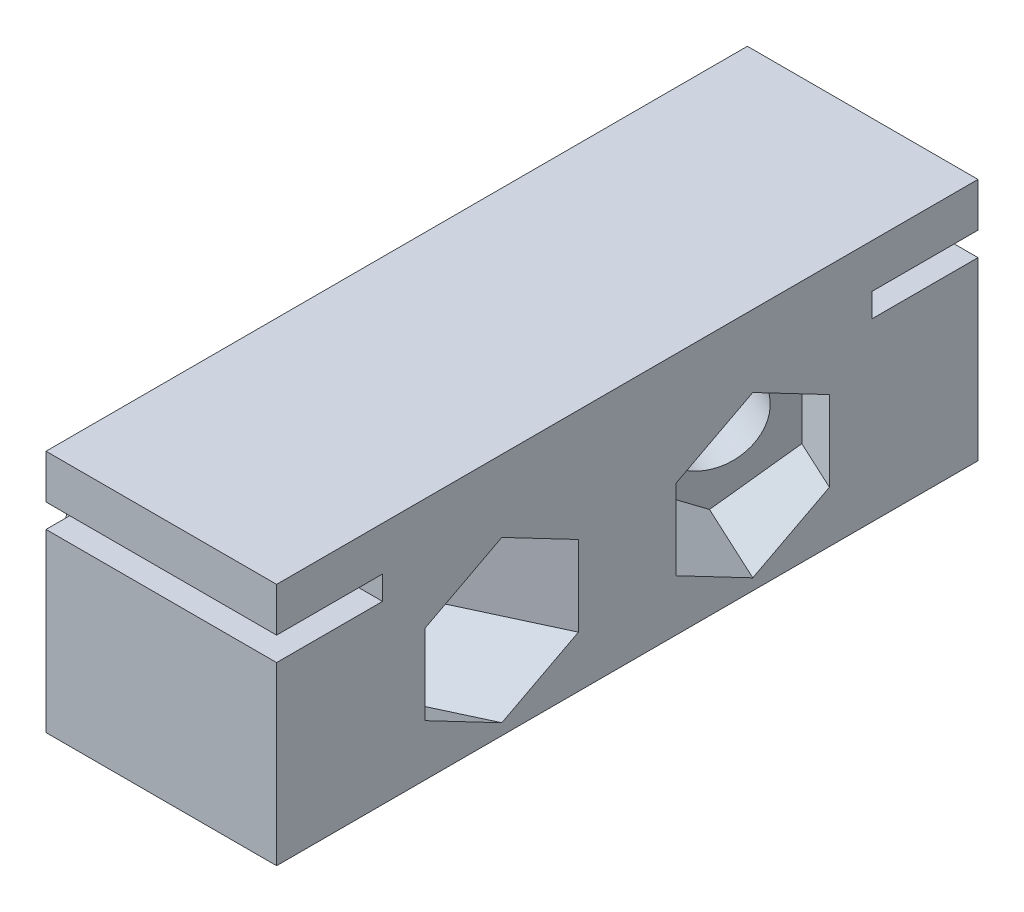
ISO-10303-21;
HEADER;
FILE_DESCRIPTION(('STEP AP214'),'2;1');
FILE_NAME('part.step','',(''),(''),'','','');
FILE_SCHEMA(('AUTOMOTIVE_DESIGN { 1 0 10303 214 1 1 1 1 }'));
ENDSEC;
DATA;
#1=APPLICATION_CONTEXT('core data for automotive mechanical design processes');
#2=APPLICATION_PROTOCOL_DEFINITION('international standard','automotive_design',2000,#1);
#3=PRODUCT_CONTEXT('',#1,'mechanical');
#4=PRODUCT('Part','Part','',(#3));
#5=PRODUCT_RELATED_PRODUCT_CATEGORY('part','',(#4));
#6=PRODUCT_DEFINITION_FORMATION('','',#4);
#7=PRODUCT_DEFINITION_CONTEXT('part definition',#1,'design');
#8=PRODUCT_DEFINITION('design','',#6,#7);
#9=PRODUCT_DEFINITION_SHAPE('','',#8);
#10=(LENGTH_UNIT() NAMED_UNIT(*) SI_UNIT(.MILLI.,.METRE.));
#11=(NAMED_UNIT(*) PLANE_ANGLE_UNIT() SI_UNIT($,.RADIAN.));
#12=(NAMED_UNIT(*) SI_UNIT($,.STERADIAN.) SOLID_ANGLE_UNIT());
#13=UNCERTAINTY_MEASURE_WITH_UNIT(LENGTH_MEASURE(1.E-05),#10,'distance_accuracy_value','');
#14=(GEOMETRIC_REPRESENTATION_CONTEXT(3) GLOBAL_UNCERTAINTY_ASSIGNED_CONTEXT((#13)) GLOBAL_UNIT_ASSIGNED_CONTEXT((#10,
#11,#12)) REPRESENTATION_CONTEXT('',''));
#15=CARTESIAN_POINT('',(0.,0.,0.));
#16=DIRECTION('',(0.,0.,1.));
#17=DIRECTION('',(1.,0.,0.));
#18=AXIS2_PLACEMENT_3D('',#15,#16,#17);
#19=CARTESIAN_POINT('',(-36.151227594584,4.03225000000007,25.3133620772626));
#20=DIRECTION('',(1.,0.,0.));
#21=DIRECTION('',(0.,1.,0.));
#22=AXIS2_PLACEMENT_3D('',#19,#20,#21);
#23=PLANE('',#22);
#24=DIRECTION('',(0.,-1.,0.));
#25=VECTOR('',#24,1.);
#26=CARTESIAN_POINT('',(-36.1512275945839,-13.55725,-25.3133620772626));
#27=LINE('',#26,#25);
#28=CARTESIAN_POINT('',(-36.151227594584,-0.857249999999983,-25.3133620772627));
#29=VERTEX_POINT('',#28);
#30=CARTESIAN_POINT('',(-36.1512275945839,-13.55725,-25.3133620772626));
#31=VERTEX_POINT('',#30);
#32=EDGE_CURVE('E258',#29,#31,#27,.T.);
#33=ORIENTED_EDGE('',*,*,#32,.T.);
#34=DIRECTION('',(0.,0.,1.));
#35=VECTOR('',#34,1.);
#36=CARTESIAN_POINT('',(-36.1512275945839,-13.55725,25.3133620772626));
#37=LINE('',#36,#35);
#38=CARTESIAN_POINT('',(-36.1512275945839,-13.55725,25.3133620772626));
#39=VERTEX_POINT('',#38);
#40=EDGE_CURVE('E229',#31,#39,#37,.T.);
#41=ORIENTED_EDGE('',*,*,#40,.T.);
#42=DIRECTION('',(0.,-1.,0.));
#43=VECTOR('',#42,1.);
#44=CARTESIAN_POINT('',(-36.1512275945839,-13.55725,25.3133620772626));
#45=LINE('',#44,#43);
#46=CARTESIAN_POINT('',(-36.1512275945839,-0.857249999999927,25.3133620772626));
#47=VERTEX_POINT('',#46);
#48=EDGE_CURVE('E264',#47,#39,#45,.T.);
#49=ORIENTED_EDGE('',*,*,#48,.F.);
#50=DIRECTION('',(0.,0.,1.));
#51=VECTOR('',#50,1.);
#52=CARTESIAN_POINT('',(-36.1512275945839,-0.857249999999983,25.3133620772626));
#53=LINE('',#52,#51);
#54=EDGE_CURVE('E413',#29,#47,#53,.T.);
#55=ORIENTED_EDGE('',*,*,#54,.F.);
#56=EDGE_LOOP('',(#33,#41,#49,#55));
#57=FACE_BOUND('',#56,.T.);
#58=CARTESIAN_POINT('',(-36.1512275945839,-6.95325,-16.7882402651653));
#59=DIRECTION('',(1.,0.,0.));
#60=DIRECTION('',(0.,0.,-1.));
#61=AXIS2_PLACEMENT_3D('',#58,#59,#60);
#62=ELLIPSE('',#61,5.51284260745173,5.);
#63=CARTESIAN_POINT('',(-36.1512275945839,-6.95325,-22.301082872617));
#64=VERTEX_POINT('',#63);
#65=EDGE_CURVE('E668',#64,#64,#62,.F.);
#66=ORIENTED_EDGE('',*,*,#65,.F.);
#67=EDGE_LOOP('',(#66));
#68=FACE_BOUND('',#67,.T.);
#69=CARTESIAN_POINT('',(-36.1512275945839,-6.95325,16.7882402651653));
#70=DIRECTION('',(1.,0.,0.));
#71=DIRECTION('',(0.,0.,1.));
#72=AXIS2_PLACEMENT_3D('',#69,#70,#71);
#73=ELLIPSE('',#72,5.51284260745173,5.);
#74=CARTESIAN_POINT('',(-36.1512275945839,-6.95325,22.301082872617));
#75=VERTEX_POINT('',#74);
#76=EDGE_CURVE('E12',#75,#75,#73,.F.);
#77=ORIENTED_EDGE('',*,*,#76,.F.);
#78=EDGE_LOOP('',(#77));
#79=FACE_BOUND('',#78,.T.);
#80=ADVANCED_FACE('F55',(#57,#68,#79),#23,.F.);
#81=CARTESIAN_POINT('',(-36.1512275945839,-0.857249999999983,25.3133620772626));
#82=DIRECTION('',(0.,-1.,0.));
#83=DIRECTION('',(1.,0.,0.));
#84=AXIS2_PLACEMENT_3D('',#81,#82,#83);
#85=PLANE('',#84);
#86=DIRECTION('',(-1.,0.,0.));
#87=VECTOR('',#86,1.);
#88=CARTESIAN_POINT('',(-19.5060580546316,-0.857249999999927,-25.3133620772626));
#89=LINE('',#88,#87);
#90=CARTESIAN_POINT('',(-19.5060580546316,-0.857249999999927,-25.3133620772626));
#91=VERTEX_POINT('',#90);
#92=EDGE_CURVE('E373',#91,#29,#89,.T.);
#93=ORIENTED_EDGE('',*,*,#92,.T.);
#94=ORIENTED_EDGE('',*,*,#54,.T.);
#95=DIRECTION('',(1.,0.,0.));
#96=VECTOR('',#95,1.);
#97=CARTESIAN_POINT('',(-36.1512275945839,-0.857249999999983,25.3133620772626));
#98=LINE('',#97,#96);
#99=CARTESIAN_POINT('',(-19.5060580546316,-0.857249999999927,25.3133620772626));
#100=VERTEX_POINT('',#99);
#101=EDGE_CURVE('E384',#47,#100,#98,.T.);
#102=ORIENTED_EDGE('',*,*,#101,.T.);
#103=DIRECTION('',(0.,0.,-1.));
#104=VECTOR('',#103,1.);
#105=CARTESIAN_POINT('',(-19.5060580546316,-0.857249999999927,25.3133620772626));
#106=LINE('',#105,#104);
#107=CARTESIAN_POINT('',(-19.5060580546316,-0.857249999999927,17.6647202985214));
#108=VERTEX_POINT('',#107);
#109=EDGE_CURVE('E70',#100,#108,#106,.T.);
#110=ORIENTED_EDGE('',*,*,#109,.T.);
#111=DIRECTION('',(1.,0.,0.));
#112=VECTOR('',#111,1.);
#113=CARTESIAN_POINT('',(-19.5060580546316,-0.857249999999926,17.6647202985214));
#114=LINE('',#113,#112);
#115=CARTESIAN_POINT('',(-25.2278350839902,-0.857249999999946,17.6647202985214));
#116=VERTEX_POINT('',#115);
#117=EDGE_CURVE('E423',#116,#108,#114,.T.);
#118=ORIENTED_EDGE('',*,*,#117,.F.);
#119=DIRECTION('',(0.,0.,1.));
#120=VECTOR('',#119,1.);
#121=CARTESIAN_POINT('',(-25.2278350839902,-0.857249999999948,-17.6647202985214));
#122=LINE('',#121,#120);
#123=CARTESIAN_POINT('',(-25.2278350839902,-0.857249999999948,-17.6647202985214));
#124=VERTEX_POINT('',#123);
#125=EDGE_CURVE('E421',#124,#116,#122,.T.);
#126=ORIENTED_EDGE('',*,*,#125,.F.);
#127=DIRECTION('',(-1.,0.,0.));
#128=VECTOR('',#127,1.);
#129=CARTESIAN_POINT('',(-25.2278350839902,-0.857249999999946,-17.6647202985214));
#130=LINE('',#129,#128);
#131=CARTESIAN_POINT('',(-19.5060580546316,-0.857249999999927,-17.6647202985214));
#132=VERTEX_POINT('',#131);
#133=EDGE_CURVE('E429',#132,#124,#130,.T.);
#134=ORIENTED_EDGE('',*,*,#133,.F.);
#135=DIRECTION('',(0.,0.,-1.));
#136=VECTOR('',#135,1.);
#137=CARTESIAN_POINT('',(-19.5060580546316,-0.857249999999927,-13.6582888906093));
#138=LINE('',#137,#136);
#139=EDGE_CURVE('E376',#132,#91,#138,.T.);
#140=ORIENTED_EDGE('',*,*,#139,.T.);
#141=EDGE_LOOP('',(#93,#94,#102,#110,#118,#126,#134,#140));
#142=FACE_BOUND('',#141,.T.);
#143=ADVANCED_FACE('F467',(#142),#85,.F.);
#144=CARTESIAN_POINT('',(-25.2278350839902,0.857250000000043,17.6647202985214));
#145=DIRECTION('',(0.,1.,0.));
#146=DIRECTION('',(-1.,0.,0.));
#147=AXIS2_PLACEMENT_3D('',#144,#145,#146);
#148=PLANE('',#147);
#149=DIRECTION('',(-1.,0.,0.));
#150=VECTOR('',#149,1.);
#151=CARTESIAN_POINT('',(-36.1512275945839,0.857250000000004,25.3133620772626));
#152=LINE('',#151,#150);
#153=CARTESIAN_POINT('',(-19.5060580546316,0.857250000000032,25.3133620772626));
#154=VERTEX_POINT('',#153);
#155=CARTESIAN_POINT('',(-36.1512275945839,0.857250000000016,25.3133620772626));
#156=VERTEX_POINT('',#155);
#157=EDGE_CURVE('E245',#154,#156,#152,.T.);
#158=ORIENTED_EDGE('',*,*,#157,.T.);
#159=DIRECTION('',(0.,0.,-1.));
#160=VECTOR('',#159,1.);
#161=CARTESIAN_POINT('',(-36.1512275945839,0.857250000000005,17.6647202985214));
#162=LINE('',#161,#160);
#163=CARTESIAN_POINT('',(-36.1512275945839,0.857250000000004,-25.3133620772626));
#164=VERTEX_POINT('',#163);
#165=EDGE_CURVE('E228',#156,#164,#162,.T.);
#166=ORIENTED_EDGE('',*,*,#165,.T.);
#167=DIRECTION('',(1.,0.,0.));
#168=VECTOR('',#167,1.);
#169=CARTESIAN_POINT('',(-36.1512275945839,0.857250000000004,-25.3133620772626));
#170=LINE('',#169,#168);
#171=CARTESIAN_POINT('',(-19.5060580546316,0.857250000000063,-25.3133620772626));
#172=VERTEX_POINT('',#171);
#173=EDGE_CURVE('E237',#164,#172,#170,.T.);
#174=ORIENTED_EDGE('',*,*,#173,.T.);
#175=DIRECTION('',(0.,0.,1.));
#176=VECTOR('',#175,1.);
#177=CARTESIAN_POINT('',(-19.5060580546316,0.857250000000063,-25.3133620772626));
#178=LINE('',#177,#176);
#179=CARTESIAN_POINT('',(-19.5060580546316,0.857250000000052,-17.6647202985214));
#180=VERTEX_POINT('',#179);
#181=EDGE_CURVE('E253',#172,#180,#178,.T.);
#182=ORIENTED_EDGE('',*,*,#181,.T.);
#183=DIRECTION('',(-1.,0.,0.));
#184=VECTOR('',#183,1.);
#185=CARTESIAN_POINT('',(-25.2278350839902,0.857250000000043,-17.6647202985214));
#186=LINE('',#185,#184);
#187=CARTESIAN_POINT('',(-25.2278350839902,0.857250000000043,-17.6647202985214));
#188=VERTEX_POINT('',#187);
#189=EDGE_CURVE('E411',#180,#188,#186,.T.);
#190=ORIENTED_EDGE('',*,*,#189,.T.);
#191=DIRECTION('',(0.,0.,1.));
#192=VECTOR('',#191,1.);
#193=CARTESIAN_POINT('',(-25.2278350839902,0.857250000000043,-17.6647202985214));
#194=LINE('',#193,#192);
#195=CARTESIAN_POINT('',(-25.2278350839902,0.857250000000043,17.6647202985214));
#196=VERTEX_POINT('',#195);
#197=EDGE_CURVE('E416',#188,#196,#194,.T.);
#198=ORIENTED_EDGE('',*,*,#197,.T.);
#199=DIRECTION('',(1.,0.,0.));
#200=VECTOR('',#199,1.);
#201=CARTESIAN_POINT('',(-19.5060580546316,0.857250000000063,17.6647202985214));
#202=LINE('',#201,#200);
#203=CARTESIAN_POINT('',(-19.5060580546316,0.857250000000063,17.6647202985214));
#204=VERTEX_POINT('',#203);
#205=EDGE_CURVE('E78',#196,#204,#202,.T.);
#206=ORIENTED_EDGE('',*,*,#205,.T.);
#207=DIRECTION('',(0.,0.,1.));
#208=VECTOR('',#207,1.);
#209=CARTESIAN_POINT('',(-19.5060580546316,0.857250000000063,25.3133620772626));
#210=LINE('',#209,#208);
#211=EDGE_CURVE('E249',#204,#154,#210,.T.);
#212=ORIENTED_EDGE('',*,*,#211,.T.);
#213=EDGE_LOOP('',(#158,#166,#174,#182,#190,#198,#206,#212));
#214=FACE_BOUND('',#213,.T.);
#215=ADVANCED_FACE('F410',(#214),#148,.F.);
#216=CARTESIAN_POINT('',(-19.5060580546314,-41.2111984324787,-13.6582888906093));
#217=DIRECTION('',(1.,0.,0.));
#218=DIRECTION('',(0.,1.,0.));
#219=AXIS2_PLACEMENT_3D('',#216,#217,#218);
#220=PLANE('',#219);
#221=ORIENTED_EDGE('',*,*,#211,.F.);
#222=DIRECTION('',(0.,-1.,0.));
#223=VECTOR('',#222,1.);
#224=CARTESIAN_POINT('',(-19.5060580546316,7.84225000000008,17.6647202985214));
#225=LINE('',#224,#223);
#226=EDGE_CURVE('E426',#204,#108,#225,.T.);
#227=ORIENTED_EDGE('',*,*,#226,.T.);
#228=ORIENTED_EDGE('',*,*,#109,.F.);
#229=DIRECTION('',(0.,-1.,0.));
#230=VECTOR('',#229,1.);
#231=CARTESIAN_POINT('',(-19.5060580546317,19.4627500000001,25.3133620772626));
#232=LINE('',#231,#230);
#233=CARTESIAN_POINT('',(-19.5060580546315,-13.5572499999999,25.3133620772626));
#234=VERTEX_POINT('',#233);
#235=EDGE_CURVE('E386',#100,#234,#232,.T.);
#236=ORIENTED_EDGE('',*,*,#235,.T.);
#237=DIRECTION('',(0.,0.,1.));
#238=VECTOR('',#237,1.);
#239=CARTESIAN_POINT('',(-19.5060580546315,-13.5572499999999,-13.6582888906093));
#240=LINE('',#239,#238);
#241=CARTESIAN_POINT('',(-19.5060580546315,-13.5572499999999,-25.3133620772626));
#242=VERTEX_POINT('',#241);
#243=EDGE_CURVE('E239',#242,#234,#240,.T.);
#244=ORIENTED_EDGE('',*,*,#243,.F.);
#245=DIRECTION('',(0.,-1.,0.));
#246=VECTOR('',#245,1.);
#247=CARTESIAN_POINT('',(-19.5060580546317,19.4627500000001,-25.3133620772626));
#248=LINE('',#247,#246);
#249=EDGE_CURVE('E377',#91,#242,#248,.T.);
#250=ORIENTED_EDGE('',*,*,#249,.F.);
#251=ORIENTED_EDGE('',*,*,#139,.F.);
#252=DIRECTION('',(0.,-1.,0.));
#253=VECTOR('',#252,1.);
#254=CARTESIAN_POINT('',(-19.5060580546316,7.84225000000008,-17.6647202985214));
#255=LINE('',#254,#253);
#256=EDGE_CURVE('E407',#180,#132,#255,.T.);
#257=ORIENTED_EDGE('',*,*,#256,.F.);
#258=ORIENTED_EDGE('',*,*,#181,.F.);
#259=DIRECTION('',(0.,1.,0.));
#260=VECTOR('',#259,1.);
#261=CARTESIAN_POINT('',(-19.5060580546315,-19.4627499999999,-25.3133620772626));
#262=LINE('',#261,#260);
#263=CARTESIAN_POINT('',(-19.5060580546316,4.03225000000004,-25.3133620772626));
#264=VERTEX_POINT('',#263);
#265=EDGE_CURVE('E244',#172,#264,#262,.T.);
#266=ORIENTED_EDGE('',*,*,#265,.T.);
#267=DIRECTION('',(0.,0.,-1.));
#268=VECTOR('',#267,1.);
#269=CARTESIAN_POINT('',(-19.5060580546316,4.03225000000004,-13.6582888906093));
#270=LINE('',#269,#268);
#271=CARTESIAN_POINT('',(-19.5060580546316,4.03225000000004,25.3133620772626));
#272=VERTEX_POINT('',#271);
#273=EDGE_CURVE('E242',#272,#264,#270,.T.);
#274=ORIENTED_EDGE('',*,*,#273,.F.);
#275=DIRECTION('',(0.,1.,0.));
#276=VECTOR('',#275,1.);
#277=CARTESIAN_POINT('',(-19.5060580546315,-19.4627499999999,25.3133620772626));
#278=LINE('',#277,#276);
#279=EDGE_CURVE('E394',#154,#272,#278,.T.);
#280=ORIENTED_EDGE('',*,*,#279,.F.);
#281=EDGE_LOOP('',(#221,#227,#228,#236,#244,#250,#251,#257,#258,#266,#274,#280));
#282=FACE_BOUND('',#281,.T.);
#283=DIRECTION('',(0.,-0.463889957252507,0.885892830742109));
#284=VECTOR('',#283,1.);
#285=CARTESIAN_POINT('',(-19.5060580546316,-0.44373980311585,7.68923079190836));
#286=LINE('',#285,#284);
#287=CARTESIAN_POINT('',(-19.5060580546316,-1.16069474922042,9.05840302077259));
#288=VERTEX_POINT('',#287);
#289=CARTESIAN_POINT('',(-19.5060580546316,-4.05697237461011,14.5894380088289));
#290=VERTEX_POINT('',#289);
#291=EDGE_CURVE('E63',#288,#290,#286,.T.);
#292=ORIENTED_EDGE('',*,*,#291,.F.);
#293=DIRECTION('',(0.,0.463889957252507,0.885892830742109));
#294=VECTOR('',#293,1.);
#295=CARTESIAN_POINT('',(-19.5060580546315,-19.1148972588694,-25.2288218615981));
#296=LINE('',#295,#294);
#297=CARTESIAN_POINT('',(-19.5060580546316,-4.05697237461018,3.52736803271627));
#298=VERTEX_POINT('',#297);
#299=EDGE_CURVE('E303',#298,#288,#296,.T.);
#300=ORIENTED_EDGE('',*,*,#299,.F.);
#301=DIRECTION('',(0.,1.,0.));
#302=VECTOR('',#301,1.);
#303=CARTESIAN_POINT('',(-19.5060580546314,-41.2111984324787,3.52736803271627));
#304=LINE('',#303,#302);
#305=CARTESIAN_POINT('',(-19.5060580546316,-9.84952762538971,3.52736803271627));
#306=VERTEX_POINT('',#305);
#307=EDGE_CURVE('E301',#306,#298,#304,.T.);
#308=ORIENTED_EDGE('',*,*,#307,.F.);
#309=DIRECTION('',(0.,0.463889957252507,-0.885892830742109));
#310=VECTOR('',#309,1.);
#311=CARTESIAN_POINT('',(-19.5060580546316,-9.53580528149998,2.92825099870761));
#312=LINE('',#311,#310);
#313=CARTESIAN_POINT('',(-19.5060580546315,-12.7458052507795,9.05840302077259));
#314=VERTEX_POINT('',#313);
#315=EDGE_CURVE('E299',#314,#306,#312,.T.);
#316=ORIENTED_EDGE('',*,*,#315,.F.);
#317=DIRECTION('',(0.,-0.463889957252507,-0.885892830742109));
#318=VECTOR('',#317,1.);
#319=CARTESIAN_POINT('',(-19.5060580546315,-28.2069627372535,-20.4678420683973));
#320=LINE('',#319,#318);
#321=CARTESIAN_POINT('',(-19.5060580546316,-9.8495276253897,14.5894380088289));
#322=VERTEX_POINT('',#321);
#323=EDGE_CURVE('E297',#322,#314,#320,.T.);
#324=ORIENTED_EDGE('',*,*,#323,.F.);
#325=DIRECTION('',(0.,-1.,0.));
#326=VECTOR('',#325,1.);
#327=CARTESIAN_POINT('',(-19.5060580546314,-41.2111984324787,14.5894380088289));
#328=LINE('',#327,#326);
#329=EDGE_CURVE('E290',#290,#322,#328,.T.);
#330=ORIENTED_EDGE('',*,*,#329,.F.);
#331=EDGE_LOOP('',(#292,#300,#308,#316,#324,#330));
#332=FACE_BOUND('',#331,.T.);
#333=DIRECTION('',(0.,0.463889957252507,-0.885892830742109));
#334=VECTOR('',#333,1.);
#335=CARTESIAN_POINT('',(-19.5060580546316,-7.88896421159487,3.7906047812526));
#336=LINE('',#335,#334);
#337=CARTESIAN_POINT('',(-19.5060580546316,-4.05697237461018,-3.52736803271627));
#338=VERTEX_POINT('',#337);
#339=CARTESIAN_POINT('',(-19.5060580546316,-1.16069474922036,-9.05840302077271));
#340=VERTEX_POINT('',#339);
#341=EDGE_CURVE('E267',#338,#340,#336,.T.);
#342=ORIENTED_EDGE('',*,*,#341,.T.);
#343=DIRECTION('',(0.,-0.463889957252507,-0.885892830742109));
#344=VECTOR('',#343,1.);
#345=CARTESIAN_POINT('',(-19.5060580546315,-11.6696728503904,-29.1274478722538));
#346=LINE('',#345,#344);
#347=CARTESIAN_POINT('',(-19.5060580546316,-4.05697237461018,-14.5894380088289));
#348=VERTEX_POINT('',#347);
#349=EDGE_CURVE('E287',#340,#348,#346,.T.);
#350=ORIENTED_EDGE('',*,*,#349,.T.);
#351=DIRECTION('',(0.,-1.,0.));
#352=VECTOR('',#351,1.);
#353=CARTESIAN_POINT('',(-19.5060580546314,-41.2111984324787,-14.5894380088289));
#354=LINE('',#353,#352);
#355=CARTESIAN_POINT('',(-19.5060580546316,-9.8495276253897,-14.5894380088289));
#356=VERTEX_POINT('',#355);
#357=EDGE_CURVE('E284',#348,#356,#354,.T.);
#358=ORIENTED_EDGE('',*,*,#357,.T.);
#359=DIRECTION('',(0.,-0.463889957252507,0.885892830742109));
#360=VECTOR('',#359,1.);
#361=CARTESIAN_POINT('',(-19.5060580546315,-16.981029689979,-0.970375011948153));
#362=LINE('',#361,#360);
#363=CARTESIAN_POINT('',(-19.5060580546315,-12.7458052507795,-9.05840302077259));
#364=VERTEX_POINT('',#363);
#365=EDGE_CURVE('E281',#356,#364,#362,.T.);
#366=ORIENTED_EDGE('',*,*,#365,.T.);
#367=DIRECTION('',(0.,0.463889957252507,0.885892830742109));
#368=VECTOR('',#367,1.);
#369=CARTESIAN_POINT('',(-19.5060580546315,-20.7617383287745,-24.3664680790531));
#370=LINE('',#369,#368);
#371=CARTESIAN_POINT('',(-19.5060580546316,-9.8495276253897,-3.52736803271627));
#372=VERTEX_POINT('',#371);
#373=EDGE_CURVE('E278',#364,#372,#370,.T.);
#374=ORIENTED_EDGE('',*,*,#373,.T.);
#375=DIRECTION('',(0.,1.,0.));
#376=VECTOR('',#375,1.);
#377=CARTESIAN_POINT('',(-19.5060580546314,-41.2111984324787,-3.52736803271627));
#378=LINE('',#377,#376);
#379=EDGE_CURVE('E275',#372,#338,#378,.T.);
#380=ORIENTED_EDGE('',*,*,#379,.T.);
#381=EDGE_LOOP('',(#342,#350,#358,#366,#374,#380));
#382=FACE_BOUND('',#381,.T.);
#383=ADVANCED_FACE('F316',(#282,#332,#382),#220,.T.);
#384=CARTESIAN_POINT('',(-19.5060580546316,-13.5572499999999,13.6582888906093));
#385=DIRECTION('',(0.,1.,0.));
#386=DIRECTION('',(-1.,0.,0.));
#387=AXIS2_PLACEMENT_3D('',#384,#385,#386);
#388=PLANE('',#387);
#389=DIRECTION('',(-1.,0.,0.));
#390=VECTOR('',#389,1.);
#391=CARTESIAN_POINT('',(-36.1512275945839,-13.55725,25.3133620772626));
#392=LINE('',#391,#390);
#393=EDGE_CURVE('E383',#234,#39,#392,.T.);
#394=ORIENTED_EDGE('',*,*,#393,.T.);
#395=ORIENTED_EDGE('',*,*,#40,.F.);
#396=DIRECTION('',(1.,0.,0.));
#397=VECTOR('',#396,1.);
#398=CARTESIAN_POINT('',(-19.5060580546315,-13.5572499999999,-25.3133620772626));
#399=LINE('',#398,#397);
#400=EDGE_CURVE('E271',#31,#242,#399,.T.);
#401=ORIENTED_EDGE('',*,*,#400,.T.);
#402=ORIENTED_EDGE('',*,*,#243,.T.);
#403=EDGE_LOOP('',(#394,#395,#401,#402));
#404=FACE_BOUND('',#403,.T.);
#405=ADVANCED_FACE('F57',(#404),#388,.F.);
#406=CARTESIAN_POINT('',(-36.1512275945839,4.03224999999998,25.3133620772626));
#407=DIRECTION('',(0.,-1.,0.));
#408=DIRECTION('',(1.,0.,0.));
#409=AXIS2_PLACEMENT_3D('',#406,#407,#408);
#410=PLANE('',#409);
#411=DIRECTION('',(-1.,0.,0.));
#412=VECTOR('',#411,1.);
#413=CARTESIAN_POINT('',(-36.1512275945839,4.03224999999998,-25.3133620772626));
#414=LINE('',#413,#412);
#415=CARTESIAN_POINT('',(-36.151227594584,4.03225000000007,-25.3133620772626));
#416=VERTEX_POINT('',#415);
#417=EDGE_CURVE('E236',#264,#416,#414,.T.);
#418=ORIENTED_EDGE('',*,*,#417,.T.);
#419=DIRECTION('',(0.,0.,1.));
#420=VECTOR('',#419,1.);
#421=CARTESIAN_POINT('',(-36.151227594584,4.03225000000007,25.3133620772626));
#422=LINE('',#421,#420);
#423=CARTESIAN_POINT('',(-36.151227594584,4.03225000000007,25.3133620772626));
#424=VERTEX_POINT('',#423);
#425=EDGE_CURVE('E217',#416,#424,#422,.T.);
#426=ORIENTED_EDGE('',*,*,#425,.T.);
#427=DIRECTION('',(1.,0.,0.));
#428=VECTOR('',#427,1.);
#429=CARTESIAN_POINT('',(-36.1512275945839,4.03224999999998,25.3133620772626));
#430=LINE('',#429,#428);
#431=EDGE_CURVE('E392',#424,#272,#430,.T.);
#432=ORIENTED_EDGE('',*,*,#431,.T.);
#433=ORIENTED_EDGE('',*,*,#273,.T.);
#434=EDGE_LOOP('',(#418,#426,#432,#433));
#435=FACE_BOUND('',#434,.T.);
#436=ADVANCED_FACE('F241',(#435),#410,.F.);
#437=CARTESIAN_POINT('',(-36.1512275945838,-19.46275,-25.3133620772626));
#438=DIRECTION('',(0.,0.,-1.));
#439=DIRECTION('',(-1.,0.,0.));
#440=AXIS2_PLACEMENT_3D('',#437,#438,#439);
#441=PLANE('',#440);
#442=ORIENTED_EDGE('',*,*,#173,.F.);
#443=DIRECTION('',(0.,-1.,0.));
#444=VECTOR('',#443,1.);
#445=CARTESIAN_POINT('',(-36.1512275945839,0.857250000000016,-25.3133620772626));
#446=LINE('',#445,#444);
#447=EDGE_CURVE('E220',#416,#164,#446,.T.);
#448=ORIENTED_EDGE('',*,*,#447,.F.);
#449=ORIENTED_EDGE('',*,*,#417,.F.);
#450=ORIENTED_EDGE('',*,*,#265,.F.);
#451=EDGE_LOOP('',(#442,#448,#449,#450));
#452=FACE_BOUND('',#451,.T.);
#453=ADVANCED_FACE('F234',(#452),#441,.T.);
#454=CARTESIAN_POINT('',(-36.1512275945838,-19.46275,25.3133620772626));
#455=DIRECTION('',(0.,0.,1.));
#456=DIRECTION('',(1.,0.,0.));
#457=AXIS2_PLACEMENT_3D('',#454,#455,#456);
#458=PLANE('',#457);
#459=ORIENTED_EDGE('',*,*,#157,.F.);
#460=ORIENTED_EDGE('',*,*,#279,.T.);
#461=ORIENTED_EDGE('',*,*,#431,.F.);
#462=DIRECTION('',(0.,-1.,0.));
#463=VECTOR('',#462,1.);
#464=CARTESIAN_POINT('',(-36.1512275945839,0.857250000000016,25.3133620772626));
#465=LINE('',#464,#463);
#466=EDGE_CURVE('E223',#424,#156,#465,.T.);
#467=ORIENTED_EDGE('',*,*,#466,.T.);
#468=EDGE_LOOP('',(#459,#460,#461,#467));
#469=FACE_BOUND('',#468,.T.);
#470=ADVANCED_FACE('F400',(#469),#458,.T.);
#471=CARTESIAN_POINT('',(-36.151227594584,19.4627500000001,25.3133620772626));
#472=DIRECTION('',(0.,0.,1.));
#473=DIRECTION('',(1.,0.,0.));
#474=AXIS2_PLACEMENT_3D('',#471,#472,#473);
#475=PLANE('',#474);
#476=ORIENTED_EDGE('',*,*,#101,.F.);
#477=ORIENTED_EDGE('',*,*,#48,.T.);
#478=ORIENTED_EDGE('',*,*,#393,.F.);
#479=ORIENTED_EDGE('',*,*,#235,.F.);
#480=EDGE_LOOP('',(#476,#477,#478,#479));
#481=FACE_BOUND('',#480,.T.);
#482=ADVANCED_FACE('F571',(#481),#475,.T.);
#483=CARTESIAN_POINT('',(-19.5060580546317,19.4627500000001,-25.3133620772626));
#484=DIRECTION('',(0.,0.,-1.));
#485=DIRECTION('',(-1.,0.,0.));
#486=AXIS2_PLACEMENT_3D('',#483,#484,#485);
#487=PLANE('',#486);
#488=ORIENTED_EDGE('',*,*,#92,.F.);
#489=ORIENTED_EDGE('',*,*,#249,.T.);
#490=ORIENTED_EDGE('',*,*,#400,.F.);
#491=ORIENTED_EDGE('',*,*,#32,.F.);
#492=EDGE_LOOP('',(#488,#489,#490,#491));
#493=FACE_BOUND('',#492,.T.);
#494=ADVANCED_FACE('F579',(#493),#487,.T.);
#495=CARTESIAN_POINT('',(-9.67558912853779,-6.95324999999991,-4.49323925645197));
#496=DIRECTION('',(-0.906973109161774,0.,-0.421188531725906));
#497=DIRECTION('',(-0.421188531725906,0.,0.906973109161774));
#498=AXIS2_PLACEMENT_3D('',#495,#496,#497);
#499=CYLINDRICAL_SURFACE('',#498,3.302);
#500=CARTESIAN_POINT('',(-25.3408286699799,-6.95324999999996,-11.7680075764218));
#501=DIRECTION('',(-0.906973109161774,0.,-0.421188531725906));
#502=DIRECTION('',(-0.421188531725906,0.,0.906973109161774));
#503=AXIS2_PLACEMENT_3D('',#500,#501,#502);
#504=CIRCLE('',#503,3.302);
#505=CARTESIAN_POINT('',(-26.7315932017389,-6.95324999999996,-8.77318236996963));
#506=VERTEX_POINT('',#505);
#507=EDGE_CURVE('E268',#506,#506,#504,.F.);
#508=ORIENTED_EDGE('',*,*,#507,.T.);
#509=EDGE_LOOP('',(#508));
#510=FACE_BOUND('',#509,.T.);
#511=CARTESIAN_POINT('',(-39.9068168031181,-6.95325000000001,-18.5322953959399));
#512=DIRECTION('',(-0.906973109161774,0.,-0.421188531725906));
#513=DIRECTION('',(-0.421188531725906,0.,0.906973109161774));
#514=AXIS2_PLACEMENT_3D('',#511,#512,#513);
#515=CIRCLE('',#514,3.302);
#516=CARTESIAN_POINT('',(-41.297581334877,-6.95325000000001,-15.5374701894877));
#517=VERTEX_POINT('',#516);
#518=EDGE_CURVE('E674',#517,#517,#515,.T.);
#519=ORIENTED_EDGE('',*,*,#518,.T.);
#520=EDGE_LOOP('',(#519));
#521=FACE_BOUND('',#520,.T.);
#522=ADVANCED_FACE('F588',(#510,#521),#499,.F.);
#523=CARTESIAN_POINT('',(-9.67558912853779,-6.95324999999991,4.49323925645197));
#524=DIRECTION('',(-0.906973109161774,0.,0.421188531725906));
#525=DIRECTION('',(0.421188531725906,0.,0.906973109161774));
#526=AXIS2_PLACEMENT_3D('',#523,#524,#525);
#527=CYLINDRICAL_SURFACE('',#526,3.302);
#528=CARTESIAN_POINT('',(-25.3408286699799,-6.95324999999996,11.7680075764218));
#529=DIRECTION('',(-0.906973109161774,0.,0.421188531725906));
#530=DIRECTION('',(0.421188531725906,0.,0.906973109161774));
#531=AXIS2_PLACEMENT_3D('',#528,#529,#530);
#532=CIRCLE('',#531,3.302);
#533=CARTESIAN_POINT('',(-23.950064138221,-6.95324999999996,14.762832782874));
#534=VERTEX_POINT('',#533);
#535=EDGE_CURVE('E291',#534,#534,#532,.F.);
#536=ORIENTED_EDGE('',*,*,#535,.T.);
#537=EDGE_LOOP('',(#536));
#538=FACE_BOUND('',#537,.T.);
#539=CARTESIAN_POINT('',(-39.9068168031181,-6.95325000000001,18.5322953959399));
#540=DIRECTION('',(0.906973109161774,0.,-0.421188531725906));
#541=DIRECTION('',(-0.421188531725906,0.,-0.906973109161774));
#542=AXIS2_PLACEMENT_3D('',#539,#540,#541);
#543=CIRCLE('',#542,3.302);
#544=CARTESIAN_POINT('',(-41.297581334877,-6.95325000000001,15.5374701894877));
#545=VERTEX_POINT('',#544);
#546=EDGE_CURVE('E665',#545,#545,#543,.T.);
#547=ORIENTED_EDGE('',*,*,#546,.F.);
#548=EDGE_LOOP('',(#547));
#549=FACE_BOUND('',#548,.T.);
#550=ADVANCED_FACE('F603',(#538,#549),#527,.F.);
#551=CARTESIAN_POINT('',(-25.34082866998,0.,-11.7680075764218));
#552=DIRECTION('',(-0.906973109161774,0.,-0.421188531725906));
#553=DIRECTION('',(-0.421188531725906,0.,0.906973109161774));
#554=AXIS2_PLACEMENT_3D('',#551,#552,#553);
#555=PLANE('',#554);
#556=DIRECTION('',(0.364759968257304,-0.499999999999999,-0.785461753083453));
#557=VECTOR('',#556,1.);
#558=CARTESIAN_POINT('',(-25.34082866998,-1.16069474922045,-11.7680075764218));
#559=LINE('',#558,#557);
#560=CARTESIAN_POINT('',(-25.34082866998,-1.16069474922045,-11.7680075764218));
#561=VERTEX_POINT('',#560);
#562=CARTESIAN_POINT('',(-23.227936400577,-4.05697237461019,-16.3178381785318));
#563=VERTEX_POINT('',#562);
#564=EDGE_CURVE('E294',#561,#563,#559,.T.);
#565=ORIENTED_EDGE('',*,*,#564,.F.);
#566=DIRECTION('',(0.364759968257301,0.500000000000001,-0.785461753083453));
#567=VECTOR('',#566,1.);
#568=CARTESIAN_POINT('',(-27.453720939383,-4.05697237461021,-7.21817697431174));
#569=LINE('',#568,#567);
#570=CARTESIAN_POINT('',(-27.453720939383,-4.05697237461021,-7.21817697431174));
#571=VERTEX_POINT('',#570);
#572=EDGE_CURVE('E355',#571,#561,#569,.T.);
#573=ORIENTED_EDGE('',*,*,#572,.F.);
#574=DIRECTION('',(0.,1.,0.));
#575=VECTOR('',#574,1.);
#576=CARTESIAN_POINT('',(-27.453720939383,-9.84952762538973,-7.21817697431174));
#577=LINE('',#576,#575);
#578=CARTESIAN_POINT('',(-27.453720939383,-9.84952762538973,-7.21817697431174));
#579=VERTEX_POINT('',#578);
#580=EDGE_CURVE('E353',#579,#571,#577,.T.);
#581=ORIENTED_EDGE('',*,*,#580,.F.);
#582=DIRECTION('',(-0.364759968257304,0.499999999999999,0.785461753083453));
#583=VECTOR('',#582,1.);
#584=CARTESIAN_POINT('',(-25.3408286699799,-12.7458052507795,-11.7680075764218));
#585=LINE('',#584,#583);
#586=CARTESIAN_POINT('',(-25.3408286699799,-12.7458052507795,-11.7680075764218));
#587=VERTEX_POINT('',#586);
#588=EDGE_CURVE('E351',#587,#579,#585,.T.);
#589=ORIENTED_EDGE('',*,*,#588,.F.);
#590=DIRECTION('',(-0.364759968257301,-0.500000000000001,0.785461753083453));
#591=VECTOR('',#590,1.);
#592=CARTESIAN_POINT('',(-23.2279364005769,-9.84952762538971,-16.3178381785318));
#593=LINE('',#592,#591);
#594=CARTESIAN_POINT('',(-23.2279364005769,-9.84952762538971,-16.3178381785318));
#595=VERTEX_POINT('',#594);
#596=EDGE_CURVE('E349',#595,#587,#593,.T.);
#597=ORIENTED_EDGE('',*,*,#596,.F.);
#598=DIRECTION('',(0.,-1.,0.));
#599=VECTOR('',#598,1.);
#600=CARTESIAN_POINT('',(-23.227936400577,-4.05697237461019,-16.3178381785318));
#601=LINE('',#600,#599);
#602=EDGE_CURVE('E347',#563,#595,#601,.T.);
#603=ORIENTED_EDGE('',*,*,#602,.F.);
#604=EDGE_LOOP('',(#565,#573,#581,#589,#597,#603));
#605=FACE_BOUND('',#604,.T.);
#606=ORIENTED_EDGE('',*,*,#507,.F.);
#607=EDGE_LOOP('',(#606));
#608=FACE_BOUND('',#607,.T.);
#609=ADVANCED_FACE('F634',(#605,#608),#555,.F.);
#610=CARTESIAN_POINT('',(-25.34082866998,-1.16069474922045,-11.7680075764218));
#611=DIRECTION('',(-0.21059426586295,-0.866025403784439,0.453486554580887));
#612=DIRECTION('',(0.,-0.463889957252506,-0.885892830742109));
#613=AXIS2_PLACEMENT_3D('',#610,#611,#612);
#614=PLANE('',#613);
#615=DIRECTION('',(0.906973109161774,0.,0.421188531725906));
#616=VECTOR('',#615,1.);
#617=CARTESIAN_POINT('',(-25.34082866998,-1.16069474922045,-11.7680075764218));
#618=LINE('',#617,#616);
#619=EDGE_CURVE('E357',#561,#340,#618,.T.);
#620=ORIENTED_EDGE('',*,*,#619,.F.);
#621=ORIENTED_EDGE('',*,*,#564,.T.);
#622=DIRECTION('',(0.906973109161774,0.,0.421188531725906));
#623=VECTOR('',#622,1.);
#624=CARTESIAN_POINT('',(-23.227936400577,-4.05697237461019,-16.3178381785318));
#625=LINE('',#624,#623);
#626=EDGE_CURVE('E272',#563,#348,#625,.T.);
#627=ORIENTED_EDGE('',*,*,#626,.T.);
#628=ORIENTED_EDGE('',*,*,#349,.F.);
#629=EDGE_LOOP('',(#620,#621,#627,#628));
#630=FACE_BOUND('',#629,.T.);
#631=ADVANCED_FACE('F699',(#630),#614,.T.);
#632=CARTESIAN_POINT('',(-23.227936400577,-4.05697237461019,-16.3178381785318));
#633=DIRECTION('',(-0.421188531725906,0.,0.906973109161774));
#634=DIRECTION('',(0.906973109161774,0.,0.421188531725906));
#635=AXIS2_PLACEMENT_3D('',#632,#633,#634);
#636=PLANE('',#635);
#637=ORIENTED_EDGE('',*,*,#626,.F.);
#638=ORIENTED_EDGE('',*,*,#602,.T.);
#639=DIRECTION('',(0.906973109161774,0.,0.421188531725906));
#640=VECTOR('',#639,1.);
#641=CARTESIAN_POINT('',(-23.2279364005769,-9.84952762538971,-16.3178381785318));
#642=LINE('',#641,#640);
#643=EDGE_CURVE('E368',#595,#356,#642,.T.);
#644=ORIENTED_EDGE('',*,*,#643,.T.);
#645=ORIENTED_EDGE('',*,*,#357,.F.);
#646=EDGE_LOOP('',(#637,#638,#644,#645));
#647=FACE_BOUND('',#646,.T.);
#648=ADVANCED_FACE('F707',(#647),#636,.T.);
#649=CARTESIAN_POINT('',(-23.2279364005769,-9.84952762538971,-16.3178381785318));
#650=DIRECTION('',(-0.210594265862956,0.866025403784438,0.453486554580887));
#651=DIRECTION('',(0.,-0.463889957252507,0.885892830742109));
#652=AXIS2_PLACEMENT_3D('',#649,#650,#651);
#653=PLANE('',#652);
#654=ORIENTED_EDGE('',*,*,#643,.F.);
#655=ORIENTED_EDGE('',*,*,#596,.T.);
#656=DIRECTION('',(0.906973109161774,0.,0.421188531725906));
#657=VECTOR('',#656,1.);
#658=CARTESIAN_POINT('',(-25.3408286699799,-12.7458052507795,-11.7680075764218));
#659=LINE('',#658,#657);
#660=EDGE_CURVE('E365',#587,#364,#659,.T.);
#661=ORIENTED_EDGE('',*,*,#660,.T.);
#662=ORIENTED_EDGE('',*,*,#365,.F.);
#663=EDGE_LOOP('',(#654,#655,#661,#662));
#664=FACE_BOUND('',#663,.T.);
#665=ADVANCED_FACE('F715',(#664),#653,.T.);
#666=CARTESIAN_POINT('',(-25.3408286699799,-12.7458052507795,-11.7680075764218));
#667=DIRECTION('',(0.21059426586295,0.866025403784439,-0.453486554580887));
#668=DIRECTION('',(0.,0.463889957252507,0.885892830742109));
#669=AXIS2_PLACEMENT_3D('',#666,#667,#668);
#670=PLANE('',#669);
#671=ORIENTED_EDGE('',*,*,#660,.F.);
#672=ORIENTED_EDGE('',*,*,#588,.T.);
#673=DIRECTION('',(0.906973109161774,0.,0.421188531725906));
#674=VECTOR('',#673,1.);
#675=CARTESIAN_POINT('',(-27.453720939383,-9.84952762538973,-7.21817697431174));
#676=LINE('',#675,#674);
#677=EDGE_CURVE('E362',#579,#372,#676,.T.);
#678=ORIENTED_EDGE('',*,*,#677,.T.);
#679=ORIENTED_EDGE('',*,*,#373,.F.);
#680=EDGE_LOOP('',(#671,#672,#678,#679));
#681=FACE_BOUND('',#680,.T.);
#682=ADVANCED_FACE('F723',(#681),#670,.T.);
#683=CARTESIAN_POINT('',(-27.453720939383,-9.84952762538973,-7.21817697431174));
#684=DIRECTION('',(0.421188531725906,0.,-0.906973109161774));
#685=DIRECTION('',(-0.906973109161774,0.,-0.421188531725906));
#686=AXIS2_PLACEMENT_3D('',#683,#684,#685);
#687=PLANE('',#686);
#688=ORIENTED_EDGE('',*,*,#677,.F.);
#689=ORIENTED_EDGE('',*,*,#580,.T.);
#690=DIRECTION('',(0.906973109161774,0.,0.421188531725906));
#691=VECTOR('',#690,1.);
#692=CARTESIAN_POINT('',(-27.453720939383,-4.05697237461021,-7.21817697431174));
#693=LINE('',#692,#691);
#694=EDGE_CURVE('E359',#571,#338,#693,.T.);
#695=ORIENTED_EDGE('',*,*,#694,.T.);
#696=ORIENTED_EDGE('',*,*,#379,.F.);
#697=EDGE_LOOP('',(#688,#689,#695,#696));
#698=FACE_BOUND('',#697,.T.);
#699=ADVANCED_FACE('F731',(#698),#687,.T.);
#700=CARTESIAN_POINT('',(-27.453720939383,-4.05697237461021,-7.21817697431174));
#701=DIRECTION('',(0.210594265862956,-0.866025403784438,-0.453486554580887));
#702=DIRECTION('',(0.,0.463889957252507,-0.885892830742109));
#703=AXIS2_PLACEMENT_3D('',#700,#701,#702);
#704=PLANE('',#703);
#705=ORIENTED_EDGE('',*,*,#694,.F.);
#706=ORIENTED_EDGE('',*,*,#572,.T.);
#707=ORIENTED_EDGE('',*,*,#619,.T.);
#708=ORIENTED_EDGE('',*,*,#341,.F.);
#709=EDGE_LOOP('',(#705,#706,#707,#708));
#710=FACE_BOUND('',#709,.T.);
#711=ADVANCED_FACE('F499',(#710),#704,.T.);
#712=CARTESIAN_POINT('',(-25.34082866998,0.,11.7680075764218));
#713=DIRECTION('',(-0.906973109161774,0.,0.421188531725906));
#714=DIRECTION('',(-0.421188531725906,0.,-0.906973109161774));
#715=AXIS2_PLACEMENT_3D('',#712,#713,#714);
#716=PLANE('',#715);
#717=DIRECTION('',(0.364759968257304,-0.499999999999999,0.785461753083453));
#718=VECTOR('',#717,1.);
#719=CARTESIAN_POINT('',(-25.34082866998,-1.16069474922045,11.7680075764218));
#720=LINE('',#719,#718);
#721=CARTESIAN_POINT('',(-25.34082866998,-1.16069474922045,11.7680075764218));
#722=VERTEX_POINT('',#721);
#723=CARTESIAN_POINT('',(-23.227936400577,-4.05697237461019,16.3178381785318));
#724=VERTEX_POINT('',#723);
#725=EDGE_CURVE('E433',#722,#724,#720,.T.);
#726=ORIENTED_EDGE('',*,*,#725,.T.);
#727=DIRECTION('',(0.,-1.,0.));
#728=VECTOR('',#727,1.);
#729=CARTESIAN_POINT('',(-23.227936400577,-4.05697237461019,16.3178381785318));
#730=LINE('',#729,#728);
#731=CARTESIAN_POINT('',(-23.2279364005769,-9.84952762538971,16.3178381785318));
#732=VERTEX_POINT('',#731);
#733=EDGE_CURVE('E335',#724,#732,#730,.T.);
#734=ORIENTED_EDGE('',*,*,#733,.T.);
#735=DIRECTION('',(-0.364759968257301,-0.500000000000001,-0.785461753083453));
#736=VECTOR('',#735,1.);
#737=CARTESIAN_POINT('',(-23.2279364005769,-9.84952762538971,16.3178381785318));
#738=LINE('',#737,#736);
#739=CARTESIAN_POINT('',(-25.3408286699799,-12.7458052507795,11.7680075764218));
#740=VERTEX_POINT('',#739);
#741=EDGE_CURVE('E329',#732,#740,#738,.T.);
#742=ORIENTED_EDGE('',*,*,#741,.T.);
#743=DIRECTION('',(-0.364759968257304,0.499999999999999,-0.785461753083453));
#744=VECTOR('',#743,1.);
#745=CARTESIAN_POINT('',(-25.3408286699799,-12.7458052507795,11.7680075764218));
#746=LINE('',#745,#744);
#747=CARTESIAN_POINT('',(-27.453720939383,-9.84952762538973,7.21817697431174));
#748=VERTEX_POINT('',#747);
#749=EDGE_CURVE('E442',#740,#748,#746,.T.);
#750=ORIENTED_EDGE('',*,*,#749,.T.);
#751=DIRECTION('',(0.,1.,0.));
#752=VECTOR('',#751,1.);
#753=CARTESIAN_POINT('',(-27.453720939383,-9.84952762538973,7.21817697431174));
#754=LINE('',#753,#752);
#755=CARTESIAN_POINT('',(-27.453720939383,-4.05697237461021,7.21817697431174));
#756=VERTEX_POINT('',#755);
#757=EDGE_CURVE('E439',#748,#756,#754,.T.);
#758=ORIENTED_EDGE('',*,*,#757,.T.);
#759=DIRECTION('',(0.364759968257301,0.500000000000001,0.785461753083453));
#760=VECTOR('',#759,1.);
#761=CARTESIAN_POINT('',(-27.453720939383,-4.05697237461021,7.21817697431174));
#762=LINE('',#761,#760);
#763=EDGE_CURVE('E436',#756,#722,#762,.T.);
#764=ORIENTED_EDGE('',*,*,#763,.T.);
#765=EDGE_LOOP('',(#726,#734,#742,#750,#758,#764));
#766=FACE_BOUND('',#765,.T.);
#767=ORIENTED_EDGE('',*,*,#535,.F.);
#768=EDGE_LOOP('',(#767));
#769=FACE_BOUND('',#768,.T.);
#770=ADVANCED_FACE('F446',(#766,#769),#716,.F.);
#771=CARTESIAN_POINT('',(-25.34082866998,-1.16069474922045,11.7680075764218));
#772=DIRECTION('',(0.21059426586295,0.866025403784439,0.453486554580887));
#773=DIRECTION('',(0.,-0.463889957252506,0.885892830742109));
#774=AXIS2_PLACEMENT_3D('',#771,#772,#773);
#775=PLANE('',#774);
#776=ORIENTED_EDGE('',*,*,#291,.T.);
#777=DIRECTION('',(0.906973109161774,0.,-0.421188531725906));
#778=VECTOR('',#777,1.);
#779=CARTESIAN_POINT('',(-23.227936400577,-4.05697237461019,16.3178381785318));
#780=LINE('',#779,#778);
#781=EDGE_CURVE('E311',#724,#290,#780,.T.);
#782=ORIENTED_EDGE('',*,*,#781,.F.);
#783=ORIENTED_EDGE('',*,*,#725,.F.);
#784=DIRECTION('',(0.906973109161774,0.,-0.421188531725906));
#785=VECTOR('',#784,1.);
#786=CARTESIAN_POINT('',(-25.34082866998,-1.16069474922045,11.7680075764218));
#787=LINE('',#786,#785);
#788=EDGE_CURVE('E295',#722,#288,#787,.T.);
#789=ORIENTED_EDGE('',*,*,#788,.T.);
#790=EDGE_LOOP('',(#776,#782,#783,#789));
#791=FACE_BOUND('',#790,.T.);
#792=ADVANCED_FACE('F309',(#791),#775,.F.);
#793=CARTESIAN_POINT('',(-27.453720939383,-4.05697237461021,7.21817697431174));
#794=DIRECTION('',(-0.210594265862956,0.866025403784438,-0.453486554580887));
#795=DIRECTION('',(0.,0.463889957252507,0.885892830742109));
#796=AXIS2_PLACEMENT_3D('',#793,#794,#795);
#797=PLANE('',#796);
#798=ORIENTED_EDGE('',*,*,#299,.T.);
#799=ORIENTED_EDGE('',*,*,#788,.F.);
#800=ORIENTED_EDGE('',*,*,#763,.F.);
#801=DIRECTION('',(0.906973109161774,0.,-0.421188531725906));
#802=VECTOR('',#801,1.);
#803=CARTESIAN_POINT('',(-27.453720939383,-4.05697237461021,7.21817697431174));
#804=LINE('',#803,#802);
#805=EDGE_CURVE('E341',#756,#298,#804,.T.);
#806=ORIENTED_EDGE('',*,*,#805,.T.);
#807=EDGE_LOOP('',(#798,#799,#800,#806));
#808=FACE_BOUND('',#807,.T.);
#809=ADVANCED_FACE('F451',(#808),#797,.F.);
#810=CARTESIAN_POINT('',(-27.453720939383,-9.84952762538973,7.21817697431174));
#811=DIRECTION('',(-0.421188531725906,0.,-0.906973109161774));
#812=DIRECTION('',(-0.906973109161774,0.,0.421188531725906));
#813=AXIS2_PLACEMENT_3D('',#810,#811,#812);
#814=PLANE('',#813);
#815=ORIENTED_EDGE('',*,*,#307,.T.);
#816=ORIENTED_EDGE('',*,*,#805,.F.);
#817=ORIENTED_EDGE('',*,*,#757,.F.);
#818=DIRECTION('',(0.906973109161774,0.,-0.421188531725906));
#819=VECTOR('',#818,1.);
#820=CARTESIAN_POINT('',(-27.453720939383,-9.84952762538973,7.21817697431174));
#821=LINE('',#820,#819);
#822=EDGE_CURVE('E333',#748,#306,#821,.T.);
#823=ORIENTED_EDGE('',*,*,#822,.T.);
#824=EDGE_LOOP('',(#815,#816,#817,#823));
#825=FACE_BOUND('',#824,.T.);
#826=ADVANCED_FACE('F454',(#825),#814,.F.);
#827=CARTESIAN_POINT('',(-25.3408286699799,-12.7458052507795,11.7680075764218));
#828=DIRECTION('',(-0.21059426586295,-0.866025403784439,-0.453486554580887));
#829=DIRECTION('',(0.,0.463889957252507,-0.885892830742109));
#830=AXIS2_PLACEMENT_3D('',#827,#828,#829);
#831=PLANE('',#830);
#832=ORIENTED_EDGE('',*,*,#315,.T.);
#833=ORIENTED_EDGE('',*,*,#822,.F.);
#834=ORIENTED_EDGE('',*,*,#749,.F.);
#835=DIRECTION('',(0.906973109161774,0.,-0.421188531725906));
#836=VECTOR('',#835,1.);
#837=CARTESIAN_POINT('',(-25.3408286699799,-12.7458052507795,11.7680075764218));
#838=LINE('',#837,#836);
#839=EDGE_CURVE('E331',#740,#314,#838,.T.);
#840=ORIENTED_EDGE('',*,*,#839,.T.);
#841=EDGE_LOOP('',(#832,#833,#834,#840));
#842=FACE_BOUND('',#841,.T.);
#843=ADVANCED_FACE('F457',(#842),#831,.F.);
#844=CARTESIAN_POINT('',(-23.2279364005769,-9.84952762538971,16.3178381785318));
#845=DIRECTION('',(0.210594265862956,-0.866025403784438,0.453486554580887));
#846=DIRECTION('',(0.,-0.463889957252507,-0.885892830742109));
#847=AXIS2_PLACEMENT_3D('',#844,#845,#846);
#848=PLANE('',#847);
#849=ORIENTED_EDGE('',*,*,#323,.T.);
#850=ORIENTED_EDGE('',*,*,#839,.F.);
#851=ORIENTED_EDGE('',*,*,#741,.F.);
#852=DIRECTION('',(0.906973109161774,0.,-0.421188531725906));
#853=VECTOR('',#852,1.);
#854=CARTESIAN_POINT('',(-23.2279364005769,-9.84952762538971,16.3178381785318));
#855=LINE('',#854,#853);
#856=EDGE_CURVE('E323',#732,#322,#855,.T.);
#857=ORIENTED_EDGE('',*,*,#856,.T.);
#858=EDGE_LOOP('',(#849,#850,#851,#857));
#859=FACE_BOUND('',#858,.T.);
#860=ADVANCED_FACE('F326',(#859),#848,.F.);
#861=CARTESIAN_POINT('',(-23.227936400577,-4.05697237461019,16.3178381785318));
#862=DIRECTION('',(0.421188531725906,0.,0.906973109161774));
#863=DIRECTION('',(0.906973109161774,0.,-0.421188531725906));
#864=AXIS2_PLACEMENT_3D('',#861,#862,#863);
#865=PLANE('',#864);
#866=ORIENTED_EDGE('',*,*,#329,.T.);
#867=ORIENTED_EDGE('',*,*,#856,.F.);
#868=ORIENTED_EDGE('',*,*,#733,.F.);
#869=ORIENTED_EDGE('',*,*,#781,.T.);
#870=EDGE_LOOP('',(#866,#867,#868,#869));
#871=FACE_BOUND('',#870,.T.);
#872=ADVANCED_FACE('F321',(#871),#865,.F.);
#873=CARTESIAN_POINT('',(-25.2278350839902,7.84225000000006,-17.6647202985214));
#874=DIRECTION('',(0.,0.,1.));
#875=DIRECTION('',(1.,0.,0.));
#876=AXIS2_PLACEMENT_3D('',#873,#874,#875);
#877=PLANE('',#876);
#878=ORIENTED_EDGE('',*,*,#189,.F.);
#879=ORIENTED_EDGE('',*,*,#256,.T.);
#880=ORIENTED_EDGE('',*,*,#133,.T.);
#881=DIRECTION('',(0.,-1.,0.));
#882=VECTOR('',#881,1.);
#883=CARTESIAN_POINT('',(-25.2278350839902,-0.857249999999968,-17.6647202985214));
#884=LINE('',#883,#882);
#885=EDGE_CURVE('E238',#188,#124,#884,.T.);
#886=ORIENTED_EDGE('',*,*,#885,.F.);
#887=EDGE_LOOP('',(#878,#879,#880,#886));
#888=FACE_BOUND('',#887,.T.);
#889=ADVANCED_FACE('F490',(#888),#877,.F.);
#890=CARTESIAN_POINT('',(-19.5060580546316,7.84225000000008,17.6647202985214));
#891=DIRECTION('',(0.,0.,-1.));
#892=DIRECTION('',(-1.,0.,0.));
#893=AXIS2_PLACEMENT_3D('',#890,#891,#892);
#894=PLANE('',#893);
#895=ORIENTED_EDGE('',*,*,#205,.F.);
#896=DIRECTION('',(0.,-1.,0.));
#897=VECTOR('',#896,1.);
#898=CARTESIAN_POINT('',(-25.2278350839902,-0.857249999999968,17.6647202985214));
#899=LINE('',#898,#897);
#900=EDGE_CURVE('E261',#196,#116,#899,.T.);
#901=ORIENTED_EDGE('',*,*,#900,.T.);
#902=ORIENTED_EDGE('',*,*,#117,.T.);
#903=ORIENTED_EDGE('',*,*,#226,.F.);
#904=EDGE_LOOP('',(#895,#901,#902,#903));
#905=FACE_BOUND('',#904,.T.);
#906=ADVANCED_FACE('F485',(#905),#894,.F.);
#907=CARTESIAN_POINT('',(-25.2278350839901,-36.6230233060058,-17.6647202985214));
#908=DIRECTION('',(-1.,0.,0.));
#909=DIRECTION('',(0.,-1.,0.));
#910=AXIS2_PLACEMENT_3D('',#907,#908,#909);
#911=PLANE('',#910);
#912=ORIENTED_EDGE('',*,*,#125,.T.);
#913=ORIENTED_EDGE('',*,*,#900,.F.);
#914=ORIENTED_EDGE('',*,*,#197,.F.);
#915=ORIENTED_EDGE('',*,*,#885,.T.);
#916=EDGE_LOOP('',(#912,#913,#914,#915));
#917=FACE_BOUND('',#916,.T.);
#918=ADVANCED_FACE('F478',(#917),#911,.T.);
#919=ORIENTED_EDGE('',*,*,#466,.F.);
#920=ORIENTED_EDGE('',*,*,#425,.F.);
#921=ORIENTED_EDGE('',*,*,#447,.T.);
#922=ORIENTED_EDGE('',*,*,#165,.F.);
#923=EDGE_LOOP('',(#919,#920,#921,#922));
#924=FACE_BOUND('',#923,.T.);
#925=ADVANCED_FACE('F219',(#924),#23,.F.);
#926=CARTESIAN_POINT('',(-22.6668914242971,-6.95324999999995,-10.526259953411));
#927=DIRECTION('',(-0.906973109161774,0.,-0.421188531725906));
#928=DIRECTION('',(-0.421188531725906,0.,0.906973109161774));
#929=AXIS2_PLACEMENT_3D('',#926,#927,#928);
#930=CYLINDRICAL_SURFACE('',#929,5.);
#931=CARTESIAN_POINT('',(-39.9068168031181,-6.95325000000001,-18.5322953959399));
#932=DIRECTION('',(-0.906973109161774,0.,-0.421188531725906));
#933=DIRECTION('',(-0.421188531725906,0.,0.906973109161774));
#934=AXIS2_PLACEMENT_3D('',#931,#932,#933);
#935=CIRCLE('',#934,5.);
#936=CARTESIAN_POINT('',(-42.0127594617476,-6.95325000000001,-13.997429850131));
#937=VERTEX_POINT('',#936);
#938=EDGE_CURVE('E671',#937,#937,#935,.T.);
#939=ORIENTED_EDGE('',*,*,#938,.F.);
#940=EDGE_LOOP('',(#939));
#941=FACE_BOUND('',#940,.T.);
#942=ORIENTED_EDGE('',*,*,#65,.T.);
#943=EDGE_LOOP('',(#942));
#944=FACE_BOUND('',#943,.T.);
#945=ADVANCED_FACE('F477',(#941,#944),#930,.T.);
#946=CARTESIAN_POINT('',(-39.9068168031181,-6.95325000000001,-18.5322953959399));
#947=DIRECTION('',(-0.906973109161774,0.,-0.421188531725906));
#948=DIRECTION('',(-0.421188531725906,0.,0.906973109161774));
#949=AXIS2_PLACEMENT_3D('',#946,#947,#948);
#950=PLANE('',#949);
#951=ORIENTED_EDGE('',*,*,#518,.F.);
#952=EDGE_LOOP('',(#951));
#953=FACE_BOUND('',#952,.T.);
#954=ORIENTED_EDGE('',*,*,#938,.T.);
#955=EDGE_LOOP('',(#954));
#956=FACE_BOUND('',#955,.T.);
#957=ADVANCED_FACE('F483',(#953,#956),#950,.T.);
#958=CARTESIAN_POINT('',(-22.6668914242971,-6.95324999999995,10.526259953411));
#959=DIRECTION('',(-0.906973109161774,0.,0.421188531725906));
#960=DIRECTION('',(0.421188531725906,0.,0.906973109161774));
#961=AXIS2_PLACEMENT_3D('',#958,#959,#960);
#962=CYLINDRICAL_SURFACE('',#961,5.);
#963=CARTESIAN_POINT('',(-39.9068168031181,-6.95325000000001,18.5322953959399));
#964=DIRECTION('',(0.906973109161774,0.,-0.421188531725906));
#965=DIRECTION('',(-0.421188531725906,0.,-0.906973109161774));
#966=AXIS2_PLACEMENT_3D('',#963,#964,#965);
#967=CIRCLE('',#966,5.);
#968=CARTESIAN_POINT('',(-42.0127594617476,-6.95325000000001,13.997429850131));
#969=VERTEX_POINT('',#968);
#970=EDGE_CURVE('E662',#969,#969,#967,.T.);
#971=ORIENTED_EDGE('',*,*,#970,.T.);
#972=EDGE_LOOP('',(#971));
#973=FACE_BOUND('',#972,.T.);
#974=ORIENTED_EDGE('',*,*,#76,.T.);
#975=EDGE_LOOP('',(#974));
#976=FACE_BOUND('',#975,.T.);
#977=ADVANCED_FACE('F619',(#973,#976),#962,.T.);
#978=CARTESIAN_POINT('',(-39.9068168031181,-6.95325000000001,18.5322953959399));
#979=DIRECTION('',(-0.906973109161774,0.,0.421188531725906));
#980=DIRECTION('',(-0.421188531725906,0.,-0.906973109161774));
#981=AXIS2_PLACEMENT_3D('',#978,#979,#980);
#982=PLANE('',#981);
#983=ORIENTED_EDGE('',*,*,#970,.F.);
#984=EDGE_LOOP('',(#983));
#985=FACE_BOUND('',#984,.T.);
#986=ORIENTED_EDGE('',*,*,#546,.T.);
#987=EDGE_LOOP('',(#986));
#988=FACE_BOUND('',#987,.T.);
#989=ADVANCED_FACE('F645',(#985,#988),#982,.T.);
#990=CLOSED_SHELL('',(#80,#143,#215,#383,#405,#436,#453,#470,#482,#494,#522,#550,#609,#631,#648,
#665,#682,#699,#711,#770,#792,#809,#826,#843,#860,#872,#889,#906,#918,#925,#945,#957,#977,#989));
#991=MANIFOLD_SOLID_BREP('B2',#990);
#992=ADVANCED_BREP_SHAPE_REPRESENTATION('',(#18,#991),#14);
#993=SHAPE_DEFINITION_REPRESENTATION(#9,#992);
ENDSEC;
END-ISO-10303-21;
